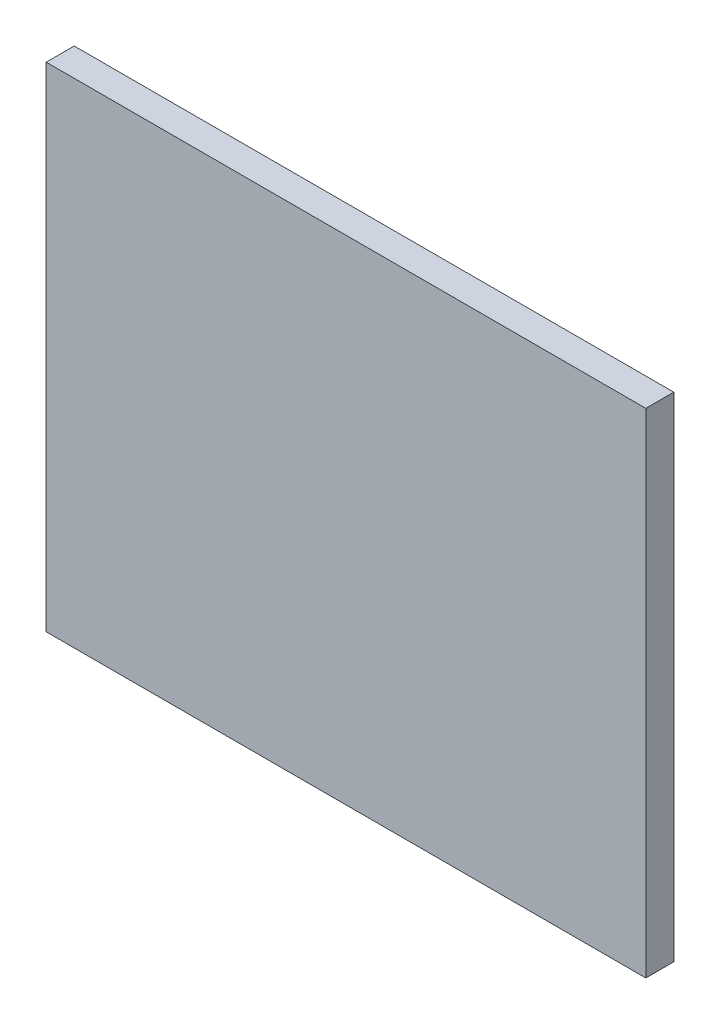
ISO-10303-21;
HEADER;
FILE_DESCRIPTION(('STEP AP214'),'2;1');
FILE_NAME('part.step','',(''),(''),'','','');
FILE_SCHEMA(('AUTOMOTIVE_DESIGN { 1 0 10303 214 1 1 1 1 }'));
ENDSEC;
DATA;
#1=APPLICATION_CONTEXT('core data for automotive mechanical design processes');
#2=APPLICATION_PROTOCOL_DEFINITION('international standard','automotive_design',2000,#1);
#3=PRODUCT_CONTEXT('',#1,'mechanical');
#4=PRODUCT('Part','Part','',(#3));
#5=PRODUCT_RELATED_PRODUCT_CATEGORY('part','',(#4));
#6=PRODUCT_DEFINITION_FORMATION('','',#4);
#7=PRODUCT_DEFINITION_CONTEXT('part definition',#1,'design');
#8=PRODUCT_DEFINITION('design','',#6,#7);
#9=PRODUCT_DEFINITION_SHAPE('','',#8);
#10=(LENGTH_UNIT() NAMED_UNIT(*) SI_UNIT(.MILLI.,.METRE.));
#11=(NAMED_UNIT(*) PLANE_ANGLE_UNIT() SI_UNIT($,.RADIAN.));
#12=(NAMED_UNIT(*) SI_UNIT($,.STERADIAN.) SOLID_ANGLE_UNIT());
#13=UNCERTAINTY_MEASURE_WITH_UNIT(LENGTH_MEASURE(1.E-05),#10,'distance_accuracy_value','');
#14=(GEOMETRIC_REPRESENTATION_CONTEXT(3) GLOBAL_UNCERTAINTY_ASSIGNED_CONTEXT((#13)) GLOBAL_UNIT_ASSIGNED_CONTEXT((#10,
#11,#12)) REPRESENTATION_CONTEXT('',''));
#15=CARTESIAN_POINT('',(0.,0.,0.));
#16=DIRECTION('',(0.,0.,1.));
#17=DIRECTION('',(1.,0.,0.));
#18=AXIS2_PLACEMENT_3D('',#15,#16,#17);
#19=CARTESIAN_POINT('',(-749.86,-617.01,70.));
#20=DIRECTION('',(1.,0.,0.));
#21=DIRECTION('',(0.,0.,-1.));
#22=AXIS2_PLACEMENT_3D('',#19,#20,#21);
#23=PLANE('',#22);
#24=DIRECTION('',(0.,-1.,0.));
#25=VECTOR('',#24,1.);
#26=CARTESIAN_POINT('',(-749.86,-617.01,0.));
#27=LINE('',#26,#25);
#28=CARTESIAN_POINT('',(-749.86,617.01,0.));
#29=VERTEX_POINT('',#28);
#30=CARTESIAN_POINT('',(-749.86,-617.01,0.));
#31=VERTEX_POINT('',#30);
#32=EDGE_CURVE('E97',#29,#31,#27,.T.);
#33=ORIENTED_EDGE('',*,*,#32,.T.);
#34=DIRECTION('',(0.,0.,-1.));
#35=VECTOR('',#34,1.);
#36=CARTESIAN_POINT('',(-749.86,-617.01,70.));
#37=LINE('',#36,#35);
#38=CARTESIAN_POINT('',(-749.86,-617.01,70.));
#39=VERTEX_POINT('',#38);
#40=EDGE_CURVE('E11',#39,#31,#37,.T.);
#41=ORIENTED_EDGE('',*,*,#40,.F.);
#42=DIRECTION('',(0.,-1.,0.));
#43=VECTOR('',#42,1.);
#44=CARTESIAN_POINT('',(-749.86,-617.01,70.));
#45=LINE('',#44,#43);
#46=CARTESIAN_POINT('',(-749.86,617.01,70.));
#47=VERTEX_POINT('',#46);
#48=EDGE_CURVE('E85',#47,#39,#45,.T.);
#49=ORIENTED_EDGE('',*,*,#48,.F.);
#50=DIRECTION('',(0.,0.,-1.));
#51=VECTOR('',#50,1.);
#52=CARTESIAN_POINT('',(-749.86,617.01,70.));
#53=LINE('',#52,#51);
#54=EDGE_CURVE('E93',#47,#29,#53,.T.);
#55=ORIENTED_EDGE('',*,*,#54,.T.);
#56=EDGE_LOOP('',(#33,#41,#49,#55));
#57=FACE_BOUND('',#56,.T.);
#58=ADVANCED_FACE('F34',(#57),#23,.F.);
#59=CARTESIAN_POINT('',(749.86,-617.01,70.));
#60=DIRECTION('',(0.,1.,0.));
#61=DIRECTION('',(-1.,0.,0.));
#62=AXIS2_PLACEMENT_3D('',#59,#60,#61);
#63=PLANE('',#62);
#64=DIRECTION('',(1.,0.,0.));
#65=VECTOR('',#64,1.);
#66=CARTESIAN_POINT('',(749.86,-617.01,0.));
#67=LINE('',#66,#65);
#68=CARTESIAN_POINT('',(749.86,-617.01,0.));
#69=VERTEX_POINT('',#68);
#70=EDGE_CURVE('E89',#31,#69,#67,.T.);
#71=ORIENTED_EDGE('',*,*,#70,.T.);
#72=DIRECTION('',(0.,0.,-1.));
#73=VECTOR('',#72,1.);
#74=CARTESIAN_POINT('',(749.86,-617.01,70.));
#75=LINE('',#74,#73);
#76=CARTESIAN_POINT('',(749.86,-617.01,70.));
#77=VERTEX_POINT('',#76);
#78=EDGE_CURVE('E42',#77,#69,#75,.T.);
#79=ORIENTED_EDGE('',*,*,#78,.F.);
#80=DIRECTION('',(1.,0.,0.));
#81=VECTOR('',#80,1.);
#82=CARTESIAN_POINT('',(749.86,-617.01,70.));
#83=LINE('',#82,#81);
#84=EDGE_CURVE('E80',#39,#77,#83,.T.);
#85=ORIENTED_EDGE('',*,*,#84,.F.);
#86=ORIENTED_EDGE('',*,*,#40,.T.);
#87=EDGE_LOOP('',(#71,#79,#85,#86));
#88=FACE_BOUND('',#87,.T.);
#89=ADVANCED_FACE('F88',(#88),#63,.F.);
#90=CARTESIAN_POINT('',(749.86,-617.01,70.));
#91=DIRECTION('',(-1.,0.,0.));
#92=DIRECTION('',(0.,0.,1.));
#93=AXIS2_PLACEMENT_3D('',#90,#91,#92);
#94=PLANE('',#93);
#95=DIRECTION('',(0.,1.,0.));
#96=VECTOR('',#95,1.);
#97=CARTESIAN_POINT('',(749.86,-617.01,0.));
#98=LINE('',#97,#96);
#99=CARTESIAN_POINT('',(749.86,617.01,0.));
#100=VERTEX_POINT('',#99);
#101=EDGE_CURVE('E67',#69,#100,#98,.T.);
#102=ORIENTED_EDGE('',*,*,#101,.T.);
#103=DIRECTION('',(0.,0.,-1.));
#104=VECTOR('',#103,1.);
#105=CARTESIAN_POINT('',(749.86,617.01,70.));
#106=LINE('',#105,#104);
#107=CARTESIAN_POINT('',(749.86,617.01,70.));
#108=VERTEX_POINT('',#107);
#109=EDGE_CURVE('E90',#108,#100,#106,.T.);
#110=ORIENTED_EDGE('',*,*,#109,.F.);
#111=DIRECTION('',(0.,1.,0.));
#112=VECTOR('',#111,1.);
#113=CARTESIAN_POINT('',(749.86,-617.01,70.));
#114=LINE('',#113,#112);
#115=EDGE_CURVE('E83',#77,#108,#114,.T.);
#116=ORIENTED_EDGE('',*,*,#115,.F.);
#117=ORIENTED_EDGE('',*,*,#78,.T.);
#118=EDGE_LOOP('',(#102,#110,#116,#117));
#119=FACE_BOUND('',#118,.T.);
#120=ADVANCED_FACE('F91',(#119),#94,.F.);
#121=CARTESIAN_POINT('',(749.86,617.01,70.));
#122=DIRECTION('',(0.,-1.,0.));
#123=DIRECTION('',(1.,0.,0.));
#124=AXIS2_PLACEMENT_3D('',#121,#122,#123);
#125=PLANE('',#124);
#126=DIRECTION('',(-1.,0.,0.));
#127=VECTOR('',#126,1.);
#128=CARTESIAN_POINT('',(749.86,617.01,0.));
#129=LINE('',#128,#127);
#130=EDGE_CURVE('E73',#100,#29,#129,.T.);
#131=ORIENTED_EDGE('',*,*,#130,.T.);
#132=ORIENTED_EDGE('',*,*,#54,.F.);
#133=DIRECTION('',(-1.,0.,0.));
#134=VECTOR('',#133,1.);
#135=CARTESIAN_POINT('',(749.86,617.01,70.));
#136=LINE('',#135,#134);
#137=EDGE_CURVE('E50',#108,#47,#136,.T.);
#138=ORIENTED_EDGE('',*,*,#137,.F.);
#139=ORIENTED_EDGE('',*,*,#109,.T.);
#140=EDGE_LOOP('',(#131,#132,#138,#139));
#141=FACE_BOUND('',#140,.T.);
#142=ADVANCED_FACE('F104',(#141),#125,.F.);
#143=CARTESIAN_POINT('',(0.,0.,70.));
#144=DIRECTION('',(0.,0.,1.));
#145=DIRECTION('',(1.,0.,0.));
#146=AXIS2_PLACEMENT_3D('',#143,#144,#145);
#147=PLANE('',#146);
#148=ORIENTED_EDGE('',*,*,#48,.T.);
#149=ORIENTED_EDGE('',*,*,#84,.T.);
#150=ORIENTED_EDGE('',*,*,#115,.T.);
#151=ORIENTED_EDGE('',*,*,#137,.T.);
#152=EDGE_LOOP('',(#148,#149,#150,#151));
#153=FACE_BOUND('',#152,.T.);
#154=ADVANCED_FACE('F81',(#153),#147,.T.);
#155=CARTESIAN_POINT('',(0.,0.,0.));
#156=DIRECTION('',(0.,0.,1.));
#157=DIRECTION('',(1.,0.,0.));
#158=AXIS2_PLACEMENT_3D('',#155,#156,#157);
#159=PLANE('',#158);
#160=ORIENTED_EDGE('',*,*,#32,.F.);
#161=ORIENTED_EDGE('',*,*,#130,.F.);
#162=ORIENTED_EDGE('',*,*,#101,.F.);
#163=ORIENTED_EDGE('',*,*,#70,.F.);
#164=EDGE_LOOP('',(#160,#161,#162,#163));
#165=FACE_BOUND('',#164,.T.);
#166=ADVANCED_FACE('F107',(#165),#159,.F.);
#167=CLOSED_SHELL('',(#58,#89,#120,#142,#154,#166));
#168=MANIFOLD_SOLID_BREP('B2',#167);
#169=ADVANCED_BREP_SHAPE_REPRESENTATION('',(#18,#168),#14);
#170=SHAPE_DEFINITION_REPRESENTATION(#9,#169);
ENDSEC;
END-ISO-10303-21;
